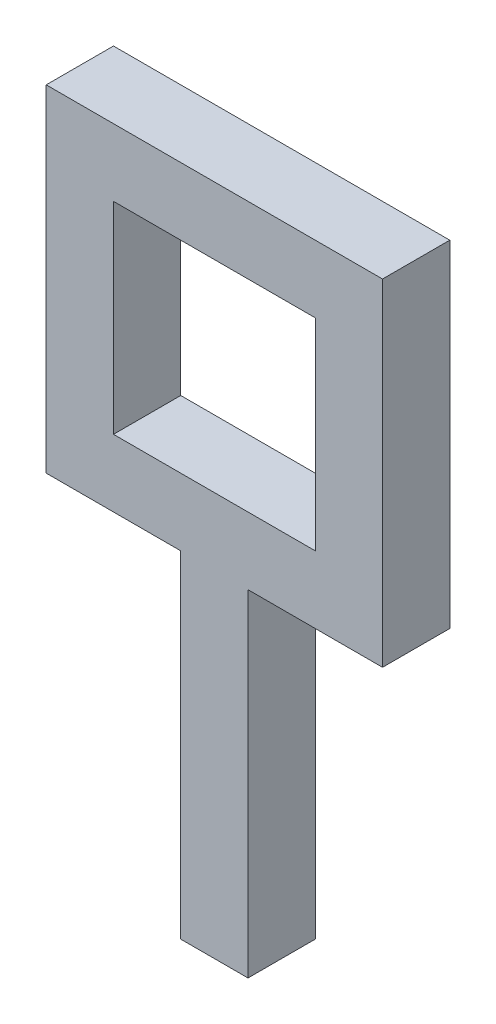
ISO-10303-21;
HEADER;
FILE_DESCRIPTION(('STEP AP214'),'2;1');
FILE_NAME('part.step','',(''),(''),'','','');
FILE_SCHEMA(('AUTOMOTIVE_DESIGN { 1 0 10303 214 1 1 1 1 }'));
ENDSEC;
DATA;
#1=APPLICATION_CONTEXT('core data for automotive mechanical design processes');
#2=APPLICATION_PROTOCOL_DEFINITION('international standard','automotive_design',2000,#1);
#3=PRODUCT_CONTEXT('',#1,'mechanical');
#4=PRODUCT('Part','Part','',(#3));
#5=PRODUCT_RELATED_PRODUCT_CATEGORY('part','',(#4));
#6=PRODUCT_DEFINITION_FORMATION('','',#4);
#7=PRODUCT_DEFINITION_CONTEXT('part definition',#1,'design');
#8=PRODUCT_DEFINITION('design','',#6,#7);
#9=PRODUCT_DEFINITION_SHAPE('','',#8);
#10=(LENGTH_UNIT() NAMED_UNIT(*) SI_UNIT(.MILLI.,.METRE.));
#11=(NAMED_UNIT(*) PLANE_ANGLE_UNIT() SI_UNIT($,.RADIAN.));
#12=(NAMED_UNIT(*) SI_UNIT($,.STERADIAN.) SOLID_ANGLE_UNIT());
#13=UNCERTAINTY_MEASURE_WITH_UNIT(LENGTH_MEASURE(1.E-05),#10,'distance_accuracy_value','');
#14=(GEOMETRIC_REPRESENTATION_CONTEXT(3) GLOBAL_UNCERTAINTY_ASSIGNED_CONTEXT((#13)) GLOBAL_UNIT_ASSIGNED_CONTEXT((#10,
#11,#12)) REPRESENTATION_CONTEXT('',''));
#15=CARTESIAN_POINT('',(0.,0.,0.));
#16=DIRECTION('',(0.,0.,1.));
#17=DIRECTION('',(1.,0.,0.));
#18=AXIS2_PLACEMENT_3D('',#15,#16,#17);
#19=CARTESIAN_POINT('',(-1.,10.,1.));
#20=DIRECTION('',(1.,0.,0.));
#21=DIRECTION('',(0.,0.,-1.));
#22=AXIS2_PLACEMENT_3D('',#19,#20,#21);
#23=PLANE('',#22);
#24=DIRECTION('',(0.,0.,1.));
#25=VECTOR('',#24,1.);
#26=CARTESIAN_POINT('',(-1.,0.,1.));
#27=LINE('',#26,#25);
#28=CARTESIAN_POINT('',(-1.,0.,-1.));
#29=VERTEX_POINT('',#28);
#30=CARTESIAN_POINT('',(-1.,0.,1.));
#31=VERTEX_POINT('',#30);
#32=EDGE_CURVE('E188',#29,#31,#27,.T.);
#33=ORIENTED_EDGE('',*,*,#32,.T.);
#34=DIRECTION('',(0.,-1.,0.));
#35=VECTOR('',#34,1.);
#36=CARTESIAN_POINT('',(-1.,10.,1.));
#37=LINE('',#36,#35);
#38=CARTESIAN_POINT('',(-1.,10.,1.));
#39=VERTEX_POINT('',#38);
#40=EDGE_CURVE('E217',#39,#31,#37,.T.);
#41=ORIENTED_EDGE('',*,*,#40,.F.);
#42=DIRECTION('',(0.,0.,1.));
#43=VECTOR('',#42,1.);
#44=CARTESIAN_POINT('',(-1.,10.,1.));
#45=LINE('',#44,#43);
#46=CARTESIAN_POINT('',(-1.,10.,-1.));
#47=VERTEX_POINT('',#46);
#48=EDGE_CURVE('E204',#47,#39,#45,.T.);
#49=ORIENTED_EDGE('',*,*,#48,.F.);
#50=DIRECTION('',(0.,-1.,0.));
#51=VECTOR('',#50,1.);
#52=CARTESIAN_POINT('',(-1.,10.,-1.));
#53=LINE('',#52,#51);
#54=EDGE_CURVE('E209',#47,#29,#53,.T.);
#55=ORIENTED_EDGE('',*,*,#54,.T.);
#56=EDGE_LOOP('',(#33,#41,#49,#55));
#57=FACE_BOUND('',#56,.T.);
#58=ADVANCED_FACE('F31',(#57),#23,.F.);
#59=CARTESIAN_POINT('',(1.,10.,1.));
#60=DIRECTION('',(0.,0.,-1.));
#61=DIRECTION('',(-1.,0.,0.));
#62=AXIS2_PLACEMENT_3D('',#59,#60,#61);
#63=PLANE('',#62);
#64=DIRECTION('',(1.,0.,0.));
#65=VECTOR('',#64,1.);
#66=CARTESIAN_POINT('',(3.,12.,1.));
#67=LINE('',#66,#65);
#68=CARTESIAN_POINT('',(-3.,12.,1.));
#69=VERTEX_POINT('',#68);
#70=CARTESIAN_POINT('',(3.,12.,1.));
#71=VERTEX_POINT('',#70);
#72=EDGE_CURVE('E131',#69,#71,#67,.T.);
#73=ORIENTED_EDGE('',*,*,#72,.F.);
#74=DIRECTION('',(0.,-1.,0.));
#75=VECTOR('',#74,1.);
#76=CARTESIAN_POINT('',(-3.,12.,1.));
#77=LINE('',#76,#75);
#78=CARTESIAN_POINT('',(-3.,18.,1.));
#79=VERTEX_POINT('',#78);
#80=EDGE_CURVE('E45',#79,#69,#77,.T.);
#81=ORIENTED_EDGE('',*,*,#80,.F.);
#82=DIRECTION('',(-1.,0.,0.));
#83=VECTOR('',#82,1.);
#84=CARTESIAN_POINT('',(3.,18.,1.));
#85=LINE('',#84,#83);
#86=CARTESIAN_POINT('',(3.,18.,1.));
#87=VERTEX_POINT('',#86);
#88=EDGE_CURVE('E138',#87,#79,#85,.T.);
#89=ORIENTED_EDGE('',*,*,#88,.F.);
#90=DIRECTION('',(0.,1.,0.));
#91=VECTOR('',#90,1.);
#92=CARTESIAN_POINT('',(3.,12.,1.));
#93=LINE('',#92,#91);
#94=EDGE_CURVE('E122',#71,#87,#93,.T.);
#95=ORIENTED_EDGE('',*,*,#94,.F.);
#96=EDGE_LOOP('',(#73,#81,#89,#95));
#97=FACE_BOUND('',#96,.T.);
#98=DIRECTION('',(1.,0.,0.));
#99=VECTOR('',#98,1.);
#100=CARTESIAN_POINT('',(1.,0.,1.));
#101=LINE('',#100,#99);
#102=CARTESIAN_POINT('',(1.,0.,1.));
#103=VERTEX_POINT('',#102);
#104=EDGE_CURVE('E191',#31,#103,#101,.T.);
#105=ORIENTED_EDGE('',*,*,#104,.T.);
#106=DIRECTION('',(0.,-1.,0.));
#107=VECTOR('',#106,1.);
#108=CARTESIAN_POINT('',(1.,10.,1.));
#109=LINE('',#108,#107);
#110=CARTESIAN_POINT('',(1.,10.,1.));
#111=VERTEX_POINT('',#110);
#112=EDGE_CURVE('E208',#111,#103,#109,.T.);
#113=ORIENTED_EDGE('',*,*,#112,.F.);
#114=DIRECTION('',(1.,0.,0.));
#115=VECTOR('',#114,1.);
#116=CARTESIAN_POINT('',(5.,10.,1.));
#117=LINE('',#116,#115);
#118=CARTESIAN_POINT('',(5.,10.,1.));
#119=VERTEX_POINT('',#118);
#120=EDGE_CURVE('E161',#111,#119,#117,.T.);
#121=ORIENTED_EDGE('',*,*,#120,.T.);
#122=DIRECTION('',(0.,-1.,0.));
#123=VECTOR('',#122,1.);
#124=CARTESIAN_POINT('',(5.,20.,1.));
#125=LINE('',#124,#123);
#126=CARTESIAN_POINT('',(5.,20.,1.));
#127=VERTEX_POINT('',#126);
#128=EDGE_CURVE('E184',#127,#119,#125,.T.);
#129=ORIENTED_EDGE('',*,*,#128,.F.);
#130=DIRECTION('',(1.,0.,0.));
#131=VECTOR('',#130,1.);
#132=CARTESIAN_POINT('',(5.,20.,1.));
#133=LINE('',#132,#131);
#134=CARTESIAN_POINT('',(-5.,20.,1.));
#135=VERTEX_POINT('',#134);
#136=EDGE_CURVE('E151',#135,#127,#133,.T.);
#137=ORIENTED_EDGE('',*,*,#136,.F.);
#138=DIRECTION('',(0.,-1.,0.));
#139=VECTOR('',#138,1.);
#140=CARTESIAN_POINT('',(-5.,20.,1.));
#141=LINE('',#140,#139);
#142=CARTESIAN_POINT('',(-5.,10.,1.));
#143=VERTEX_POINT('',#142);
#144=EDGE_CURVE('E186',#135,#143,#141,.T.);
#145=ORIENTED_EDGE('',*,*,#144,.T.);
#146=EDGE_CURVE('E170',#143,#39,#117,.T.);
#147=ORIENTED_EDGE('',*,*,#146,.T.);
#148=ORIENTED_EDGE('',*,*,#40,.T.);
#149=EDGE_LOOP('',(#105,#113,#121,#129,#137,#145,#147,#148));
#150=FACE_BOUND('',#149,.T.);
#151=ADVANCED_FACE('F135',(#97,#150),#63,.F.);
#152=CARTESIAN_POINT('',(1.,10.,1.));
#153=DIRECTION('',(-1.,0.,0.));
#154=DIRECTION('',(0.,0.,1.));
#155=AXIS2_PLACEMENT_3D('',#152,#153,#154);
#156=PLANE('',#155);
#157=DIRECTION('',(0.,0.,-1.));
#158=VECTOR('',#157,1.);
#159=CARTESIAN_POINT('',(1.,0.,1.));
#160=LINE('',#159,#158);
#161=CARTESIAN_POINT('',(1.,0.,-1.));
#162=VERTEX_POINT('',#161);
#163=EDGE_CURVE('E196',#103,#162,#160,.T.);
#164=ORIENTED_EDGE('',*,*,#163,.T.);
#165=DIRECTION('',(0.,-1.,0.));
#166=VECTOR('',#165,1.);
#167=CARTESIAN_POINT('',(1.,10.,-1.));
#168=LINE('',#167,#166);
#169=CARTESIAN_POINT('',(1.,10.,-1.));
#170=VERTEX_POINT('',#169);
#171=EDGE_CURVE('E205',#170,#162,#168,.T.);
#172=ORIENTED_EDGE('',*,*,#171,.F.);
#173=DIRECTION('',(0.,0.,-1.));
#174=VECTOR('',#173,1.);
#175=CARTESIAN_POINT('',(1.,10.,1.));
#176=LINE('',#175,#174);
#177=EDGE_CURVE('E212',#111,#170,#176,.T.);
#178=ORIENTED_EDGE('',*,*,#177,.F.);
#179=ORIENTED_EDGE('',*,*,#112,.T.);
#180=EDGE_LOOP('',(#164,#172,#178,#179));
#181=FACE_BOUND('',#180,.T.);
#182=ADVANCED_FACE('F256',(#181),#156,.F.);
#183=CARTESIAN_POINT('',(1.,10.,-1.));
#184=DIRECTION('',(0.,0.,1.));
#185=DIRECTION('',(1.,0.,0.));
#186=AXIS2_PLACEMENT_3D('',#183,#184,#185);
#187=PLANE('',#186);
#188=DIRECTION('',(-1.,0.,0.));
#189=VECTOR('',#188,1.);
#190=CARTESIAN_POINT('',(1.,18.,-1.));
#191=LINE('',#190,#189);
#192=CARTESIAN_POINT('',(3.,18.,-1.));
#193=VERTEX_POINT('',#192);
#194=CARTESIAN_POINT('',(-3.,18.,-1.));
#195=VERTEX_POINT('',#194);
#196=EDGE_CURVE('E38',#193,#195,#191,.T.);
#197=ORIENTED_EDGE('',*,*,#196,.T.);
#198=DIRECTION('',(0.,-1.,0.));
#199=VECTOR('',#198,1.);
#200=CARTESIAN_POINT('',(-3.,10.,-1.));
#201=LINE('',#200,#199);
#202=CARTESIAN_POINT('',(-3.,12.,-1.));
#203=VERTEX_POINT('',#202);
#204=EDGE_CURVE('E11',#195,#203,#201,.T.);
#205=ORIENTED_EDGE('',*,*,#204,.T.);
#206=DIRECTION('',(1.,0.,0.));
#207=VECTOR('',#206,1.);
#208=CARTESIAN_POINT('',(1.,12.,-1.));
#209=LINE('',#208,#207);
#210=CARTESIAN_POINT('',(3.,12.,-1.));
#211=VERTEX_POINT('',#210);
#212=EDGE_CURVE('E225',#203,#211,#209,.T.);
#213=ORIENTED_EDGE('',*,*,#212,.T.);
#214=DIRECTION('',(0.,1.,0.));
#215=VECTOR('',#214,1.);
#216=CARTESIAN_POINT('',(3.,10.,-1.));
#217=LINE('',#216,#215);
#218=EDGE_CURVE('E125',#211,#193,#217,.T.);
#219=ORIENTED_EDGE('',*,*,#218,.T.);
#220=EDGE_LOOP('',(#197,#205,#213,#219));
#221=FACE_BOUND('',#220,.T.);
#222=DIRECTION('',(-1.,0.,0.));
#223=VECTOR('',#222,1.);
#224=CARTESIAN_POINT('',(1.,0.,-1.));
#225=LINE('',#224,#223);
#226=EDGE_CURVE('E202',#162,#29,#225,.T.);
#227=ORIENTED_EDGE('',*,*,#226,.T.);
#228=ORIENTED_EDGE('',*,*,#54,.F.);
#229=DIRECTION('',(-1.,0.,0.));
#230=VECTOR('',#229,1.);
#231=CARTESIAN_POINT('',(5.,10.,-1.));
#232=LINE('',#231,#230);
#233=CARTESIAN_POINT('',(-5.,10.,-1.));
#234=VERTEX_POINT('',#233);
#235=EDGE_CURVE('E173',#47,#234,#232,.T.);
#236=ORIENTED_EDGE('',*,*,#235,.T.);
#237=DIRECTION('',(0.,-1.,0.));
#238=VECTOR('',#237,1.);
#239=CARTESIAN_POINT('',(-5.,20.,-1.));
#240=LINE('',#239,#238);
#241=CARTESIAN_POINT('',(-5.,20.,-1.));
#242=VERTEX_POINT('',#241);
#243=EDGE_CURVE('E158',#242,#234,#240,.T.);
#244=ORIENTED_EDGE('',*,*,#243,.F.);
#245=DIRECTION('',(-1.,0.,0.));
#246=VECTOR('',#245,1.);
#247=CARTESIAN_POINT('',(5.,20.,-1.));
#248=LINE('',#247,#246);
#249=CARTESIAN_POINT('',(5.,20.,-1.));
#250=VERTEX_POINT('',#249);
#251=EDGE_CURVE('E156',#250,#242,#248,.T.);
#252=ORIENTED_EDGE('',*,*,#251,.F.);
#253=DIRECTION('',(0.,-1.,0.));
#254=VECTOR('',#253,1.);
#255=CARTESIAN_POINT('',(5.,20.,-1.));
#256=LINE('',#255,#254);
#257=CARTESIAN_POINT('',(5.,10.,-1.));
#258=VERTEX_POINT('',#257);
#259=EDGE_CURVE('E181',#250,#258,#256,.T.);
#260=ORIENTED_EDGE('',*,*,#259,.T.);
#261=EDGE_CURVE('E152',#258,#170,#232,.T.);
#262=ORIENTED_EDGE('',*,*,#261,.T.);
#263=ORIENTED_EDGE('',*,*,#171,.T.);
#264=EDGE_LOOP('',(#227,#228,#236,#244,#252,#260,#262,#263));
#265=FACE_BOUND('',#264,.T.);
#266=ADVANCED_FACE('F234',(#221,#265),#187,.F.);
#267=CARTESIAN_POINT('',(-1.,0.,-1.));
#268=DIRECTION('',(0.,1.,0.));
#269=DIRECTION('',(0.,0.,1.));
#270=AXIS2_PLACEMENT_3D('',#267,#268,#269);
#271=PLANE('',#270);
#272=ORIENTED_EDGE('',*,*,#32,.F.);
#273=ORIENTED_EDGE('',*,*,#226,.F.);
#274=ORIENTED_EDGE('',*,*,#163,.F.);
#275=ORIENTED_EDGE('',*,*,#104,.F.);
#276=EDGE_LOOP('',(#272,#273,#274,#275));
#277=FACE_BOUND('',#276,.T.);
#278=ADVANCED_FACE('F265',(#277),#271,.F.);
#279=CARTESIAN_POINT('',(-5.,10.,-1.));
#280=DIRECTION('',(0.,1.,0.));
#281=DIRECTION('',(0.,0.,1.));
#282=AXIS2_PLACEMENT_3D('',#279,#280,#281);
#283=PLANE('',#282);
#284=ORIENTED_EDGE('',*,*,#235,.F.);
#285=ORIENTED_EDGE('',*,*,#48,.T.);
#286=ORIENTED_EDGE('',*,*,#146,.F.);
#287=DIRECTION('',(0.,0.,1.));
#288=VECTOR('',#287,1.);
#289=CARTESIAN_POINT('',(-5.,10.,1.));
#290=LINE('',#289,#288);
#291=EDGE_CURVE('E145',#234,#143,#290,.T.);
#292=ORIENTED_EDGE('',*,*,#291,.F.);
#293=EDGE_LOOP('',(#284,#285,#286,#292));
#294=FACE_BOUND('',#293,.T.);
#295=ADVANCED_FACE('F268',(#294),#283,.F.);
#296=ORIENTED_EDGE('',*,*,#120,.F.);
#297=ORIENTED_EDGE('',*,*,#177,.T.);
#298=ORIENTED_EDGE('',*,*,#261,.F.);
#299=DIRECTION('',(0.,0.,-1.));
#300=VECTOR('',#299,1.);
#301=CARTESIAN_POINT('',(5.,10.,1.));
#302=LINE('',#301,#300);
#303=EDGE_CURVE('E164',#119,#258,#302,.T.);
#304=ORIENTED_EDGE('',*,*,#303,.F.);
#305=EDGE_LOOP('',(#296,#297,#298,#304));
#306=FACE_BOUND('',#305,.T.);
#307=ADVANCED_FACE('F273',(#306),#283,.F.);
#308=CARTESIAN_POINT('',(-5.,20.,1.));
#309=DIRECTION('',(1.,0.,0.));
#310=DIRECTION('',(0.,0.,-1.));
#311=AXIS2_PLACEMENT_3D('',#308,#309,#310);
#312=PLANE('',#311);
#313=ORIENTED_EDGE('',*,*,#291,.T.);
#314=ORIENTED_EDGE('',*,*,#144,.F.);
#315=DIRECTION('',(0.,0.,1.));
#316=VECTOR('',#315,1.);
#317=CARTESIAN_POINT('',(-5.,20.,1.));
#318=LINE('',#317,#316);
#319=EDGE_CURVE('E148',#242,#135,#318,.T.);
#320=ORIENTED_EDGE('',*,*,#319,.F.);
#321=ORIENTED_EDGE('',*,*,#243,.T.);
#322=EDGE_LOOP('',(#313,#314,#320,#321));
#323=FACE_BOUND('',#322,.T.);
#324=ADVANCED_FACE('F270',(#323),#312,.F.);
#325=CARTESIAN_POINT('',(5.,20.,1.));
#326=DIRECTION('',(-1.,0.,0.));
#327=DIRECTION('',(0.,0.,1.));
#328=AXIS2_PLACEMENT_3D('',#325,#326,#327);
#329=PLANE('',#328);
#330=ORIENTED_EDGE('',*,*,#303,.T.);
#331=ORIENTED_EDGE('',*,*,#259,.F.);
#332=DIRECTION('',(0.,0.,-1.));
#333=VECTOR('',#332,1.);
#334=CARTESIAN_POINT('',(5.,20.,1.));
#335=LINE('',#334,#333);
#336=EDGE_CURVE('E154',#127,#250,#335,.T.);
#337=ORIENTED_EDGE('',*,*,#336,.F.);
#338=ORIENTED_EDGE('',*,*,#128,.T.);
#339=EDGE_LOOP('',(#330,#331,#337,#338));
#340=FACE_BOUND('',#339,.T.);
#341=ADVANCED_FACE('F248',(#340),#329,.F.);
#342=CARTESIAN_POINT('',(-5.,20.,-1.));
#343=DIRECTION('',(0.,1.,0.));
#344=DIRECTION('',(0.,0.,1.));
#345=AXIS2_PLACEMENT_3D('',#342,#343,#344);
#346=PLANE('',#345);
#347=ORIENTED_EDGE('',*,*,#319,.T.);
#348=ORIENTED_EDGE('',*,*,#136,.T.);
#349=ORIENTED_EDGE('',*,*,#336,.T.);
#350=ORIENTED_EDGE('',*,*,#251,.T.);
#351=EDGE_LOOP('',(#347,#348,#349,#350));
#352=FACE_BOUND('',#351,.T.);
#353=ADVANCED_FACE('F241',(#352),#346,.T.);
#354=CARTESIAN_POINT('',(-3.,12.,-1.00005));
#355=DIRECTION('',(-1.,0.,0.));
#356=DIRECTION('',(0.,0.,1.));
#357=AXIS2_PLACEMENT_3D('',#354,#355,#356);
#358=PLANE('',#357);
#359=DIRECTION('',(0.,0.,1.));
#360=VECTOR('',#359,1.);
#361=CARTESIAN_POINT('',(-3.,18.,-1.00005));
#362=LINE('',#361,#360);
#363=EDGE_CURVE('E143',#195,#79,#362,.T.);
#364=ORIENTED_EDGE('',*,*,#363,.T.);
#365=ORIENTED_EDGE('',*,*,#80,.T.);
#366=DIRECTION('',(0.,0.,1.));
#367=VECTOR('',#366,1.);
#368=CARTESIAN_POINT('',(-3.,12.,-1.00005));
#369=LINE('',#368,#367);
#370=EDGE_CURVE('E128',#203,#69,#369,.T.);
#371=ORIENTED_EDGE('',*,*,#370,.F.);
#372=ORIENTED_EDGE('',*,*,#204,.F.);
#373=EDGE_LOOP('',(#364,#365,#371,#372));
#374=FACE_BOUND('',#373,.T.);
#375=ADVANCED_FACE('F239',(#374),#358,.F.);
#376=CARTESIAN_POINT('',(3.,18.,-1.00005));
#377=DIRECTION('',(0.,1.,0.));
#378=DIRECTION('',(0.,0.,1.));
#379=AXIS2_PLACEMENT_3D('',#376,#377,#378);
#380=PLANE('',#379);
#381=DIRECTION('',(0.,0.,1.));
#382=VECTOR('',#381,1.);
#383=CARTESIAN_POINT('',(3.,18.,-1.00005));
#384=LINE('',#383,#382);
#385=EDGE_CURVE('E127',#193,#87,#384,.T.);
#386=ORIENTED_EDGE('',*,*,#385,.T.);
#387=ORIENTED_EDGE('',*,*,#88,.T.);
#388=ORIENTED_EDGE('',*,*,#363,.F.);
#389=ORIENTED_EDGE('',*,*,#196,.F.);
#390=EDGE_LOOP('',(#386,#387,#388,#389));
#391=FACE_BOUND('',#390,.T.);
#392=ADVANCED_FACE('F238',(#391),#380,.F.);
#393=CARTESIAN_POINT('',(3.,12.,-1.00005));
#394=DIRECTION('',(1.,0.,0.));
#395=DIRECTION('',(0.,0.,-1.));
#396=AXIS2_PLACEMENT_3D('',#393,#394,#395);
#397=PLANE('',#396);
#398=DIRECTION('',(0.,0.,1.));
#399=VECTOR('',#398,1.);
#400=CARTESIAN_POINT('',(3.,12.,-1.00005));
#401=LINE('',#400,#399);
#402=EDGE_CURVE('E53',#211,#71,#401,.T.);
#403=ORIENTED_EDGE('',*,*,#402,.T.);
#404=ORIENTED_EDGE('',*,*,#94,.T.);
#405=ORIENTED_EDGE('',*,*,#385,.F.);
#406=ORIENTED_EDGE('',*,*,#218,.F.);
#407=EDGE_LOOP('',(#403,#404,#405,#406));
#408=FACE_BOUND('',#407,.T.);
#409=ADVANCED_FACE('F119',(#408),#397,.F.);
#410=CARTESIAN_POINT('',(3.,12.,-1.00005));
#411=DIRECTION('',(0.,-1.,0.));
#412=DIRECTION('',(0.,0.,-1.));
#413=AXIS2_PLACEMENT_3D('',#410,#411,#412);
#414=PLANE('',#413);
#415=ORIENTED_EDGE('',*,*,#370,.T.);
#416=ORIENTED_EDGE('',*,*,#72,.T.);
#417=ORIENTED_EDGE('',*,*,#402,.F.);
#418=ORIENTED_EDGE('',*,*,#212,.F.);
#419=EDGE_LOOP('',(#415,#416,#417,#418));
#420=FACE_BOUND('',#419,.T.);
#421=ADVANCED_FACE('F132',(#420),#414,.F.);
#422=CLOSED_SHELL('',(#58,#151,#182,#266,#278,#295,#307,#324,#341,#353,#375,#392,#409,#421));
#423=MANIFOLD_SOLID_BREP('B2',#422);
#424=ADVANCED_BREP_SHAPE_REPRESENTATION('',(#18,#423),#14);
#425=SHAPE_DEFINITION_REPRESENTATION(#9,#424);
ENDSEC;
END-ISO-10303-21;
